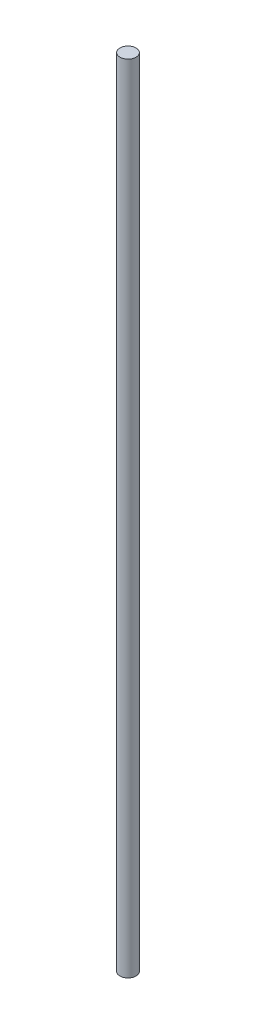
ISO-10303-21;
HEADER;
FILE_DESCRIPTION(('STEP AP214'),'2;1');
FILE_NAME('part.step','',(''),(''),'','','');
FILE_SCHEMA(('AUTOMOTIVE_DESIGN { 1 0 10303 214 1 1 1 1 }'));
ENDSEC;
DATA;
#1=APPLICATION_CONTEXT('core data for automotive mechanical design processes');
#2=APPLICATION_PROTOCOL_DEFINITION('international standard','automotive_design',2000,#1);
#3=PRODUCT_CONTEXT('',#1,'mechanical');
#4=PRODUCT('Part','Part','',(#3));
#5=PRODUCT_RELATED_PRODUCT_CATEGORY('part','',(#4));
#6=PRODUCT_DEFINITION_FORMATION('','',#4);
#7=PRODUCT_DEFINITION_CONTEXT('part definition',#1,'design');
#8=PRODUCT_DEFINITION('design','',#6,#7);
#9=PRODUCT_DEFINITION_SHAPE('','',#8);
#10=(LENGTH_UNIT() NAMED_UNIT(*) SI_UNIT(.MILLI.,.METRE.));
#11=(NAMED_UNIT(*) PLANE_ANGLE_UNIT() SI_UNIT($,.RADIAN.));
#12=(NAMED_UNIT(*) SI_UNIT($,.STERADIAN.) SOLID_ANGLE_UNIT());
#13=UNCERTAINTY_MEASURE_WITH_UNIT(LENGTH_MEASURE(1.E-05),#10,'distance_accuracy_value','');
#14=(GEOMETRIC_REPRESENTATION_CONTEXT(3) GLOBAL_UNCERTAINTY_ASSIGNED_CONTEXT((#13)) GLOBAL_UNIT_ASSIGNED_CONTEXT((#10,
#11,#12)) REPRESENTATION_CONTEXT('',''));
#15=CARTESIAN_POINT('',(0.,0.,0.));
#16=DIRECTION('',(0.,0.,1.));
#17=DIRECTION('',(1.,0.,0.));
#18=AXIS2_PLACEMENT_3D('',#15,#16,#17);
#19=CARTESIAN_POINT('',(0.,49.5,0.));
#20=DIRECTION('',(0.,-1.,0.));
#21=DIRECTION('',(0.,0.,-1.));
#22=AXIS2_PLACEMENT_3D('',#19,#20,#21);
#23=CYLINDRICAL_SURFACE('',#22,1.);
#24=CARTESIAN_POINT('',(0.,49.5,0.));
#25=DIRECTION('',(0.,1.,0.));
#26=DIRECTION('',(0.,0.,1.));
#27=AXIS2_PLACEMENT_3D('',#24,#25,#26);
#28=CIRCLE('',#27,1.);
#29=CARTESIAN_POINT('',(0.,49.5,1.));
#30=VERTEX_POINT('',#29);
#31=EDGE_CURVE('E10',#30,#30,#28,.T.);
#32=ORIENTED_EDGE('',*,*,#31,.F.);
#33=EDGE_LOOP('',(#32));
#34=FACE_BOUND('',#33,.T.);
#35=CARTESIAN_POINT('',(0.,-49.5,0.));
#36=DIRECTION('',(0.,1.,0.));
#37=DIRECTION('',(0.,0.,1.));
#38=AXIS2_PLACEMENT_3D('',#35,#36,#37);
#39=CIRCLE('',#38,1.);
#40=CARTESIAN_POINT('',(0.,-49.5,1.));
#41=VERTEX_POINT('',#40);
#42=EDGE_CURVE('E34',#41,#41,#39,.T.);
#43=ORIENTED_EDGE('',*,*,#42,.T.);
#44=EDGE_LOOP('',(#43));
#45=FACE_BOUND('',#44,.T.);
#46=ADVANCED_FACE('F31',(#34,#45),#23,.T.);
#47=CARTESIAN_POINT('',(0.,49.5,0.));
#48=DIRECTION('',(0.,1.,0.));
#49=DIRECTION('',(0.,0.,1.));
#50=AXIS2_PLACEMENT_3D('',#47,#48,#49);
#51=PLANE('',#50);
#52=ORIENTED_EDGE('',*,*,#31,.T.);
#53=EDGE_LOOP('',(#52));
#54=FACE_BOUND('',#53,.T.);
#55=ADVANCED_FACE('F46',(#54),#51,.T.);
#56=CARTESIAN_POINT('',(0.,-49.5,0.));
#57=DIRECTION('',(0.,1.,0.));
#58=DIRECTION('',(0.,0.,1.));
#59=AXIS2_PLACEMENT_3D('',#56,#57,#58);
#60=PLANE('',#59);
#61=ORIENTED_EDGE('',*,*,#42,.F.);
#62=EDGE_LOOP('',(#61));
#63=FACE_BOUND('',#62,.T.);
#64=ADVANCED_FACE('F44',(#63),#60,.F.);
#65=CLOSED_SHELL('',(#46,#55,#64));
#66=MANIFOLD_SOLID_BREP('B2',#65);
#67=ADVANCED_BREP_SHAPE_REPRESENTATION('',(#18,#66),#14);
#68=SHAPE_DEFINITION_REPRESENTATION(#9,#67);
ENDSEC;
END-ISO-10303-21;
